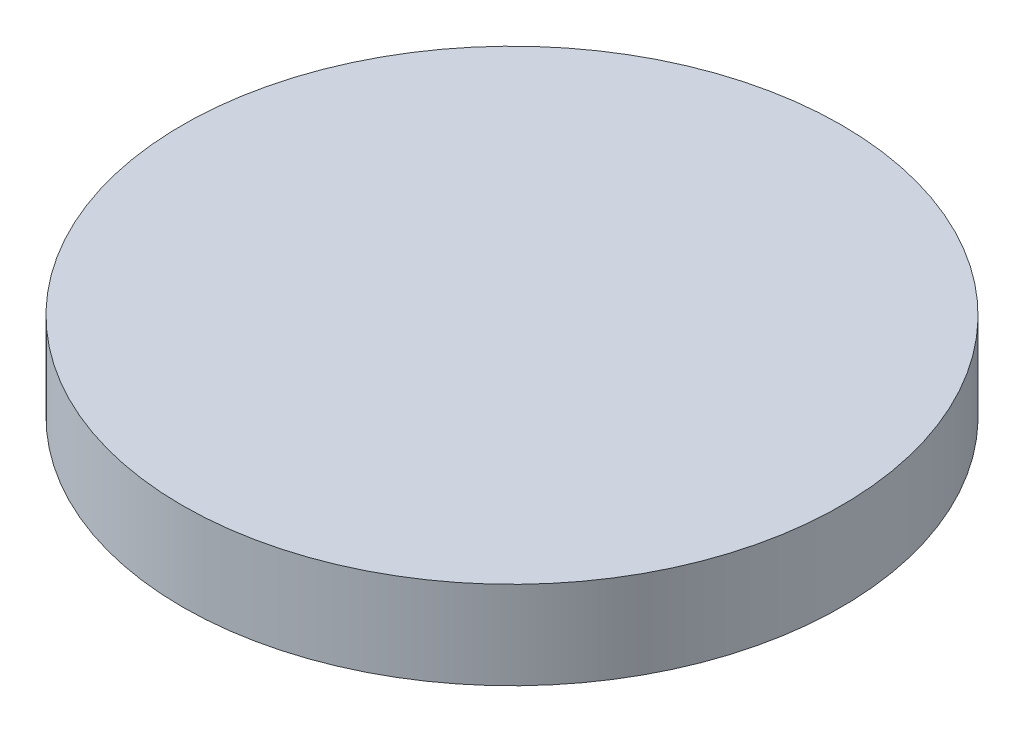
ISO-10303-21;
HEADER;
FILE_DESCRIPTION(('STEP AP214'),'2;1');
FILE_NAME('part.step','',(''),(''),'','','');
FILE_SCHEMA(('AUTOMOTIVE_DESIGN { 1 0 10303 214 1 1 1 1 }'));
ENDSEC;
DATA;
#1=APPLICATION_CONTEXT('core data for automotive mechanical design processes');
#2=APPLICATION_PROTOCOL_DEFINITION('international standard','automotive_design',2000,#1);
#3=PRODUCT_CONTEXT('',#1,'mechanical');
#4=PRODUCT('Part','Part','',(#3));
#5=PRODUCT_RELATED_PRODUCT_CATEGORY('part','',(#4));
#6=PRODUCT_DEFINITION_FORMATION('','',#4);
#7=PRODUCT_DEFINITION_CONTEXT('part definition',#1,'design');
#8=PRODUCT_DEFINITION('design','',#6,#7);
#9=PRODUCT_DEFINITION_SHAPE('','',#8);
#10=(LENGTH_UNIT() NAMED_UNIT(*) SI_UNIT(.MILLI.,.METRE.));
#11=(NAMED_UNIT(*) PLANE_ANGLE_UNIT() SI_UNIT($,.RADIAN.));
#12=(NAMED_UNIT(*) SI_UNIT($,.STERADIAN.) SOLID_ANGLE_UNIT());
#13=UNCERTAINTY_MEASURE_WITH_UNIT(LENGTH_MEASURE(1.E-05),#10,'distance_accuracy_value','');
#14=(GEOMETRIC_REPRESENTATION_CONTEXT(3) GLOBAL_UNCERTAINTY_ASSIGNED_CONTEXT((#13)) GLOBAL_UNIT_ASSIGNED_CONTEXT((#10,
#11,#12)) REPRESENTATION_CONTEXT('',''));
#15=CARTESIAN_POINT('',(0.,0.,0.));
#16=DIRECTION('',(0.,0.,1.));
#17=DIRECTION('',(1.,0.,0.));
#18=AXIS2_PLACEMENT_3D('',#15,#16,#17);
#19=CARTESIAN_POINT('',(0.,5.08,0.));
#20=DIRECTION('',(0.,-1.,0.));
#21=DIRECTION('',(0.,0.,-1.));
#22=AXIS2_PLACEMENT_3D('',#19,#20,#21);
#23=CYLINDRICAL_SURFACE('',#22,19.05);
#24=CARTESIAN_POINT('',(0.,5.08,0.));
#25=DIRECTION('',(0.,1.,0.));
#26=DIRECTION('',(0.,0.,1.));
#27=AXIS2_PLACEMENT_3D('',#24,#25,#26);
#28=CIRCLE('',#27,19.05);
#29=CARTESIAN_POINT('',(0.,5.08,19.05));
#30=VERTEX_POINT('',#29);
#31=EDGE_CURVE('E10',#30,#30,#28,.T.);
#32=ORIENTED_EDGE('',*,*,#31,.F.);
#33=EDGE_LOOP('',(#32));
#34=FACE_BOUND('',#33,.T.);
#35=CARTESIAN_POINT('',(0.,0.,0.));
#36=DIRECTION('',(0.,1.,0.));
#37=DIRECTION('',(0.,0.,1.));
#38=AXIS2_PLACEMENT_3D('',#35,#36,#37);
#39=CIRCLE('',#38,19.05);
#40=CARTESIAN_POINT('',(0.,0.,19.05));
#41=VERTEX_POINT('',#40);
#42=EDGE_CURVE('E38',#41,#41,#39,.T.);
#43=ORIENTED_EDGE('',*,*,#42,.T.);
#44=EDGE_LOOP('',(#43));
#45=FACE_BOUND('',#44,.T.);
#46=ADVANCED_FACE('F35',(#34,#45),#23,.T.);
#47=CARTESIAN_POINT('',(0.,5.08,0.));
#48=DIRECTION('',(0.,1.,0.));
#49=DIRECTION('',(0.,0.,1.));
#50=AXIS2_PLACEMENT_3D('',#47,#48,#49);
#51=PLANE('',#50);
#52=ORIENTED_EDGE('',*,*,#31,.T.);
#53=EDGE_LOOP('',(#52));
#54=FACE_BOUND('',#53,.T.);
#55=ADVANCED_FACE('F50',(#54),#51,.T.);
#56=CARTESIAN_POINT('',(0.,0.,0.));
#57=DIRECTION('',(0.,1.,0.));
#58=DIRECTION('',(0.,0.,1.));
#59=AXIS2_PLACEMENT_3D('',#56,#57,#58);
#60=PLANE('',#59);
#61=ORIENTED_EDGE('',*,*,#42,.F.);
#62=EDGE_LOOP('',(#61));
#63=FACE_BOUND('',#62,.T.);
#64=ADVANCED_FACE('F48',(#63),#60,.F.);
#65=CLOSED_SHELL('',(#46,#55,#64));
#66=MANIFOLD_SOLID_BREP('B2',#65);
#67=ADVANCED_BREP_SHAPE_REPRESENTATION('',(#18,#66),#14);
#68=SHAPE_DEFINITION_REPRESENTATION(#9,#67);
ENDSEC;
END-ISO-10303-21;
